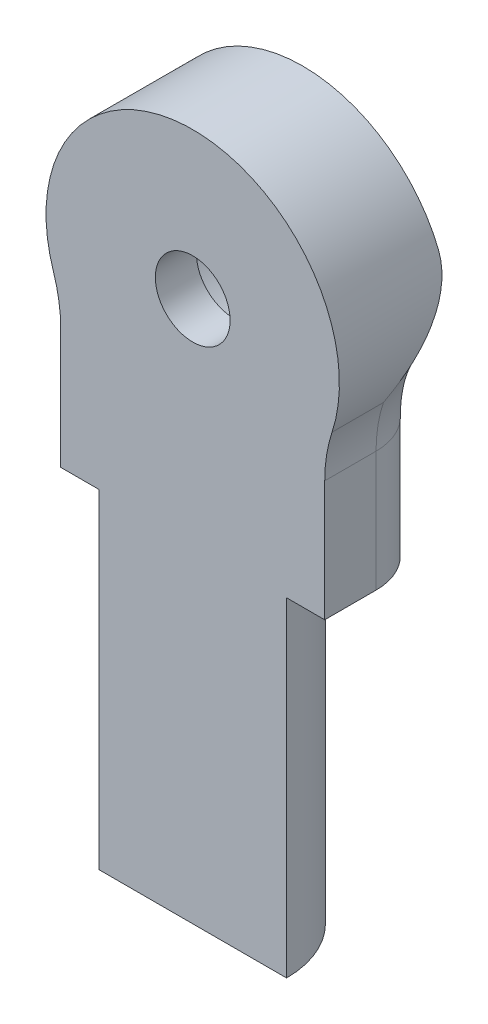
ISO-10303-21;
HEADER;
FILE_DESCRIPTION(('STEP AP214'),'2;1');
FILE_NAME('part.step','',(''),(''),'','','');
FILE_SCHEMA(('AUTOMOTIVE_DESIGN { 1 0 10303 214 1 1 1 1 }'));
ENDSEC;
DATA;
#1=APPLICATION_CONTEXT('core data for automotive mechanical design processes');
#2=APPLICATION_PROTOCOL_DEFINITION('international standard','automotive_design',2000,#1);
#3=PRODUCT_CONTEXT('',#1,'mechanical');
#4=PRODUCT('Part','Part','',(#3));
#5=PRODUCT_RELATED_PRODUCT_CATEGORY('part','',(#4));
#6=PRODUCT_DEFINITION_FORMATION('','',#4);
#7=PRODUCT_DEFINITION_CONTEXT('part definition',#1,'design');
#8=PRODUCT_DEFINITION('design','',#6,#7);
#9=PRODUCT_DEFINITION_SHAPE('','',#8);
#10=(LENGTH_UNIT() NAMED_UNIT(*) SI_UNIT(.MILLI.,.METRE.));
#11=(NAMED_UNIT(*) PLANE_ANGLE_UNIT() SI_UNIT($,.RADIAN.));
#12=(NAMED_UNIT(*) SI_UNIT($,.STERADIAN.) SOLID_ANGLE_UNIT());
#13=UNCERTAINTY_MEASURE_WITH_UNIT(LENGTH_MEASURE(1.E-05),#10,'distance_accuracy_value','');
#14=(GEOMETRIC_REPRESENTATION_CONTEXT(3) GLOBAL_UNCERTAINTY_ASSIGNED_CONTEXT((#13)) GLOBAL_UNIT_ASSIGNED_CONTEXT((#10,
#11,#12)) REPRESENTATION_CONTEXT('',''));
#15=CARTESIAN_POINT('',(0.,0.,0.));
#16=DIRECTION('',(0.,0.,1.));
#17=DIRECTION('',(1.,0.,0.));
#18=AXIS2_PLACEMENT_3D('',#15,#16,#17);
#19=CARTESIAN_POINT('',(386.036266541694,1436.9001334927,-7.54354295016557));
#20=DIRECTION('',(0.,1.,0.));
#21=DIRECTION('',(0.,0.,1.));
#22=AXIS2_PLACEMENT_3D('',#19,#20,#21);
#23=PLANE('',#22);
#24=CARTESIAN_POINT('',(386.84094038867,1436.90013349268,-5.42759696128918E-12));
#25=DIRECTION('',(0.,1.,2.55709941051272E-12));
#26=DIRECTION('',(0.,-2.55709941051272E-12,1.));
#27=AXIS2_PLACEMENT_3D('',#24,#25,#26);
#28=CIRCLE('',#27,7.49999999999444);
#29=CARTESIAN_POINT('',(386.0362665417,1436.90013349269,-7.45670838909509));
#30=VERTEX_POINT('',#29);
#31=CARTESIAN_POINT('',(387.64561423564,1436.90013349269,-7.456708389095));
#32=VERTEX_POINT('',#31);
#33=EDGE_CURVE('E20',#30,#32,#28,.F.);
#34=ORIENTED_EDGE('',*,*,#33,.F.);
#35=DIRECTION('',(0.,0.,-1.));
#36=VECTOR('',#35,1.);
#37=CARTESIAN_POINT('',(386.036266541701,1436.9001334927,-5.15000000000001));
#38=LINE('',#37,#36);
#39=CARTESIAN_POINT('',(386.036266541699,1436.9001334927,-2.8));
#40=VERTEX_POINT('',#39);
#41=EDGE_CURVE('E118',#40,#30,#38,.T.);
#42=ORIENTED_EDGE('',*,*,#41,.F.);
#43=DIRECTION('',(1.,0.,0.));
#44=VECTOR('',#43,1.);
#45=CARTESIAN_POINT('',(386.840940388668,1436.9001334927,-2.8));
#46=LINE('',#45,#44);
#47=CARTESIAN_POINT('',(387.645614235642,1436.9001334927,-2.8));
#48=VERTEX_POINT('',#47);
#49=EDGE_CURVE('E112',#40,#48,#46,.T.);
#50=ORIENTED_EDGE('',*,*,#49,.T.);
#51=DIRECTION('',(0.,0.,1.));
#52=VECTOR('',#51,1.);
#53=CARTESIAN_POINT('',(387.645614235642,1436.9001334927,-5.15000000000001));
#54=LINE('',#53,#52);
#55=EDGE_CURVE('E114',#32,#48,#54,.T.);
#56=ORIENTED_EDGE('',*,*,#55,.F.);
#57=EDGE_LOOP('',(#34,#42,#50,#56));
#58=FACE_BOUND('',#57,.T.);
#59=ADVANCED_FACE('F16',(#58),#23,.T.);
#60=CARTESIAN_POINT('',(386.84094038867,1436.85013349268,-5.55545193181572E-12));
#61=DIRECTION('',(0.,1.,2.55709941051272E-12));
#62=DIRECTION('',(0.,-2.55709941051272E-12,1.));
#63=AXIS2_PLACEMENT_3D('',#60,#61,#62);
#64=CYLINDRICAL_SURFACE('',#63,7.49999999999444);
#65=CARTESIAN_POINT('',(386.840940388673,1436.8501334927,-7.5));
#66=CARTESIAN_POINT('',(386.975954930748,1436.85016545624,-7.4999670887391));
#67=CARTESIAN_POINT('',(387.110518355698,1436.85434810467,-7.49634299886668));
#68=CARTESIAN_POINT('',(387.378742971354,1436.87101477134,-7.48191246189858));
#69=CARTESIAN_POINT('',(387.512404162059,1436.88349878957,-7.47110601480267));
#70=CARTESIAN_POINT('',(387.64561423564,1436.9001334927,-7.45670838909501));
#71=B_SPLINE_CURVE_WITH_KNOTS('',3,(#65,#66,#67,#68,#69,#70),.UNSPECIFIED.,.F.,.F.,(4,2,4),(0.,
0.404031552217608,0.808063104447917),.UNSPECIFIED.);
#72=CARTESIAN_POINT('',(386.840940388671,1436.8501334927,-7.5));
#73=VERTEX_POINT('',#72);
#74=EDGE_CURVE('E107',#73,#32,#71,.T.);
#75=ORIENTED_EDGE('',*,*,#74,.F.);
#76=CARTESIAN_POINT('',(386.0362665417,1436.9001334927,-7.45670838909508));
#77=CARTESIAN_POINT('',(386.169476615282,1436.88349878957,-7.47110601480281));
#78=CARTESIAN_POINT('',(386.303137805988,1436.87101477134,-7.48191246189875));
#79=CARTESIAN_POINT('',(386.571362421646,1436.85434810467,-7.49634299886683));
#80=CARTESIAN_POINT('',(386.705925846597,1436.85016545624,-7.4999670887392));
#81=CARTESIAN_POINT('',(386.840940388672,1436.8501334927,-7.5));
#82=B_SPLINE_CURVE_WITH_KNOTS('',3,(#76,#77,#78,#79,#80,#81),.UNSPECIFIED.,.F.,.F.,(4,2,4),(0.,
0.404031552232706,0.808063104452681),.UNSPECIFIED.);
#83=EDGE_CURVE('E110',#30,#73,#82,.T.);
#84=ORIENTED_EDGE('',*,*,#83,.F.);
#85=ORIENTED_EDGE('',*,*,#33,.T.);
#86=EDGE_LOOP('',(#75,#84,#85));
#87=FACE_BOUND('',#86,.T.);
#88=ADVANCED_FACE('F105',(#87),#64,.T.);
#89=CARTESIAN_POINT('',(386.840940388669,1443.3501334927,-2.8));
#90=DIRECTION('',(0.,0.,-1.));
#91=DIRECTION('',(-1.,0.,0.));
#92=AXIS2_PLACEMENT_3D('',#89,#90,#91);
#93=CYLINDRICAL_SURFACE('',#92,6.49999999999992);
#94=CARTESIAN_POINT('',(386.840940388669,1443.3501334927,-7.5));
#95=DIRECTION('',(0.,0.,-1.));
#96=DIRECTION('',(-1.,0.,0.));
#97=AXIS2_PLACEMENT_3D('',#94,#95,#96);
#98=CIRCLE('',#97,6.49999999999992);
#99=CARTESIAN_POINT('',(381.643795548625,1439.44632951304,-7.4999999999991));
#100=VERTEX_POINT('',#99);
#101=EDGE_CURVE('E205',#100,#73,#98,.F.);
#102=ORIENTED_EDGE('',*,*,#101,.F.);
#103=CARTESIAN_POINT('',(380.341210228718,1443.40936057959,-7.49999999999863));
#104=CARTESIAN_POINT('',(380.340428309313,1443.32355292125,-7.49999660013714));
#105=CARTESIAN_POINT('',(380.341345963116,1443.23774289222,-7.49942033392304));
#106=CARTESIAN_POINT('',(380.346576284159,1443.06623919709,-7.49747011062883));
#107=CARTESIAN_POINT('',(380.35088878153,1442.98054552538,-7.49609619346202));
#108=CARTESIAN_POINT('',(380.368910392512,1442.72383750533,-7.49130041846639));
#109=CARTESIAN_POINT('',(380.387703356597,1442.55316628389,-7.48720429433616));
#110=CARTESIAN_POINT('',(380.438086849718,1442.2181234057,-7.47958497365233));
#111=CARTESIAN_POINT('',(380.469343648116,1442.05370126578,-7.47604995926381));
#112=CARTESIAN_POINT('',(380.544450292191,1441.72773446541,-7.47084536837135));
#113=CARTESIAN_POINT('',(380.588299087525,1441.56618956616,-7.46917563633437));
#114=CARTESIAN_POINT('',(380.692710338751,1441.23297444878,-7.46827487958888));
#115=CARTESIAN_POINT('',(380.754400078274,1441.06165620964,-7.46927019357547));
#116=CARTESIAN_POINT('',(380.89194159599,1440.72477332455,-7.47378876066873));
#117=CARTESIAN_POINT('',(380.967796673923,1440.55921002985,-7.47731260332748));
#118=CARTESIAN_POINT('',(381.092918215878,1440.31385363849,-7.48332907719486));
#119=CARTESIAN_POINT('',(381.137196926199,1440.23147070031,-7.48549090728031));
#120=CARTESIAN_POINT('',(381.229270925507,1440.06868454212,-7.48971759650977));
#121=CARTESIAN_POINT('',(381.277066196328,1439.98828131189,-7.49178245615461));
#122=CARTESIAN_POINT('',(381.376079177603,1439.82961722929,-7.49544069594076));
#123=CARTESIAN_POINT('',(381.427296355337,1439.75135604611,-7.49703414926184));
#124=CARTESIAN_POINT('',(381.533067520764,1439.59710331552,-7.49931024272438));
#125=CARTESIAN_POINT('',(381.58762168092,1439.52111188572,-7.49999283574916));
#126=CARTESIAN_POINT('',(381.643795548622,1439.44632951305,-7.49999999999863));
#127=B_SPLINE_CURVE_WITH_KNOTS('',3,(#103,#104,#105,#106,#107,#108,#109,#110,#111,#112,#113,
#114,#115,#116,#117,#118,#119,#120,#121,#122,#123,#124,#125,#126),.UNSPECIFIED.,.F.,.F.,(4,2,2,
2,2,2,2,2,2,2,2,4),(0.,0.257391077907962,0.51476927744936,1.02943632632727,1.53116006417002,
2.03284196360218,2.57845187543987,3.12418904310797,3.40477721648319,3.68536394049902,
3.96590708414515,4.24646473907436),.UNSPECIFIED.);
#128=CARTESIAN_POINT('',(380.341210228718,1443.4093605796,-7.4999999999991));
#129=VERTEX_POINT('',#128);
#130=EDGE_CURVE('E151',#129,#100,#127,.T.);
#131=ORIENTED_EDGE('',*,*,#130,.F.);
#132=CARTESIAN_POINT('',(386.840940388669,1443.3501334927,-7.5));
#133=DIRECTION('',(0.,0.,-1.));
#134=DIRECTION('',(-1.,0.,0.));
#135=AXIS2_PLACEMENT_3D('',#132,#133,#134);
#136=CIRCLE('',#135,6.49999999999992);
#137=CARTESIAN_POINT('',(393.34067054862,1443.40936057959,-7.50000000000003));
#138=VERTEX_POINT('',#137);
#139=EDGE_CURVE('E159',#138,#129,#136,.F.);
#140=ORIENTED_EDGE('',*,*,#139,.F.);
#141=CARTESIAN_POINT('',(392.038085228719,1439.44632951305,-7.50000000000005));
#142=CARTESIAN_POINT('',(392.089622196025,1439.51494078493,-7.49999660013862));
#143=CARTESIAN_POINT('',(392.139792413368,1439.58456227918,-7.49942033392457));
#144=CARTESIAN_POINT('',(392.237330827045,1439.72572577148,-7.49747011063048));
#145=CARTESIAN_POINT('',(392.28469916345,1439.79726767327,-7.49609619346373));
#146=CARTESIAN_POINT('',(392.422490168395,1440.01460939724,-7.49130041846828));
#147=CARTESIAN_POINT('',(392.508616768749,1440.16314912269,-7.48720429433816));
#148=CARTESIAN_POINT('',(392.666830556635,1440.46274989693,-7.47958497365453));
#149=CARTESIAN_POINT('',(392.739216347724,1440.6136535907,-7.4760499592661));
#150=CARTESIAN_POINT('',(392.872143390748,1440.92061574497,-7.47084536837379));
#151=CARTESIAN_POINT('',(392.932685629888,1441.07667377458,-7.46917563633686));
#152=CARTESIAN_POINT('',(393.046322708055,1441.40685650929,-7.46827487959143));
#153=CARTESIAN_POINT('',(393.098301263484,1441.58136666028,-7.46927019357803));
#154=CARTESIAN_POINT('',(393.187444471318,1441.93415730055,-7.47378876067124));
#155=CARTESIAN_POINT('',(393.22460566576,1442.11243865972,-7.47731260332992));
#156=CARTESIAN_POINT('',(393.269446590916,1442.38418201377,-7.48332907719717));
#157=CARTESIAN_POINT('',(393.282677951092,1442.47676972246,-7.48549090728258));
#158=CARTESIAN_POINT('',(393.305135308694,1442.66243776423,-7.48971759651191));
#159=CARTESIAN_POINT('',(393.314361326809,1442.75551809477,-7.49178245615668));
#160=CARTESIAN_POINT('',(393.328787280317,1442.9419845889,-7.49544069594266));
#161=CARTESIAN_POINT('',(393.333987840813,1443.03537070275,-7.49703414926365));
#162=CARTESIAN_POINT('',(393.340356312052,1443.22229551893,-7.49931024272601));
#163=CARTESIAN_POINT('',(393.34152401419,1443.31583422891,-7.49999283575068));
#164=CARTESIAN_POINT('',(393.34067054862,1443.40936057959,-7.50000000000005));
#165=B_SPLINE_CURVE_WITH_KNOTS('',3,(#141,#142,#143,#144,#145,#146,#147,#148,#149,#150,#151,
#152,#153,#154,#155,#156,#157,#158,#159,#160,#161,#162,#163,#164),.UNSPECIFIED.,.F.,.F.,(4,2,2,
2,2,2,2,2,2,2,2,4),(0.,0.257391077907742,0.514769277449198,1.02943632632671,1.53116006416917,
2.0328419636007,2.57845187543807,3.12418904310537,3.40477721648091,3.68536394049646,
3.96590708414197,4.24646473907042),.UNSPECIFIED.);
#166=CARTESIAN_POINT('',(392.038085228718,1439.44632951305,-7.50000000000003));
#167=VERTEX_POINT('',#166);
#168=EDGE_CURVE('E144',#167,#138,#165,.T.);
#169=ORIENTED_EDGE('',*,*,#168,.F.);
#170=CARTESIAN_POINT('',(386.840940388669,1443.3501334927,-7.5));
#171=DIRECTION('',(0.,0.,-1.));
#172=DIRECTION('',(-1.,0.,0.));
#173=AXIS2_PLACEMENT_3D('',#170,#171,#172);
#174=CIRCLE('',#173,6.49999999999992);
#175=EDGE_CURVE('E123',#73,#167,#174,.F.);
#176=ORIENTED_EDGE('',*,*,#175,.F.);
#177=ORIENTED_EDGE('',*,*,#74,.T.);
#178=ORIENTED_EDGE('',*,*,#55,.T.);
#179=CARTESIAN_POINT('',(386.840940388669,1443.3501334927,-2.8));
#180=DIRECTION('',(0.,0.,-1.));
#181=DIRECTION('',(-1.,0.,0.));
#182=AXIS2_PLACEMENT_3D('',#179,#180,#181);
#183=CIRCLE('',#182,6.49999999999992);
#184=EDGE_CURVE('E201',#40,#48,#183,.T.);
#185=ORIENTED_EDGE('',*,*,#184,.F.);
#186=ORIENTED_EDGE('',*,*,#41,.T.);
#187=ORIENTED_EDGE('',*,*,#83,.T.);
#188=EDGE_LOOP('',(#102,#131,#140,#169,#176,#177,#178,#185,#186,#187));
#189=FACE_BOUND('',#188,.T.);
#190=ADVANCED_FACE('F121',(#189),#93,.F.);
#191=CARTESIAN_POINT('',(405.840940388658,1437.1051354943,-3.50000000000484));
#192=DIRECTION('',(0.,0.,1.));
#193=DIRECTION('',(1.,0.,0.));
#194=AXIS2_PLACEMENT_3D('',#191,#192,#193);
#195=TOROIDAL_SURFACE('',#194,13.9999999999879,3.9999999999952);
#196=CARTESIAN_POINT('',(391.840940388671,1437.1051354943,-3.50000000000166));
#197=DIRECTION('',(0.,-1.,0.));
#198=DIRECTION('',(0.,0.,-1.));
#199=AXIS2_PLACEMENT_3D('',#196,#197,#198);
#200=CIRCLE('',#199,3.99999999999927);
#201=CARTESIAN_POINT('',(391.840940388671,1437.1051354943,-7.50000000000027));
#202=VERTEX_POINT('',#201);
#203=CARTESIAN_POINT('',(395.840940388669,1437.1051354943,-3.49999999999991));
#204=VERTEX_POINT('',#203);
#205=EDGE_CURVE('E204',#202,#204,#200,.T.);
#206=ORIENTED_EDGE('',*,*,#205,.F.);
#207=CARTESIAN_POINT('',(405.840940388658,1437.1051354943,-7.50000000000004));
#208=DIRECTION('',(0.,0.,1.));
#209=DIRECTION('',(1.,0.,0.));
#210=AXIS2_PLACEMENT_3D('',#207,#208,#209);
#211=CIRCLE('',#210,13.9999999999888);
#212=EDGE_CURVE('E213',#167,#202,#211,.T.);
#213=ORIENTED_EDGE('',*,*,#212,.F.);
#214=ORIENTED_EDGE('',*,*,#168,.T.);
#215=CARTESIAN_POINT('',(405.840940388658,1437.1051354943,-7.50000000000004));
#216=DIRECTION('',(0.,0.,1.));
#217=DIRECTION('',(1.,0.,0.));
#218=AXIS2_PLACEMENT_3D('',#215,#216,#217);
#219=CIRCLE('',#218,13.9999999999893);
#220=CARTESIAN_POINT('',(396.090324531704,1447.15130344083,-7.50000000000003));
#221=VERTEX_POINT('',#220);
#222=EDGE_CURVE('E394',#221,#138,#219,.T.);
#223=ORIENTED_EDGE('',*,*,#222,.F.);
#224=CARTESIAN_POINT('',(396.090324531705,1447.15130344083,-7.50000000000005));
#225=CARTESIAN_POINT('',(396.143817208727,1447.02121284627,-7.50002436433455));
#226=CARTESIAN_POINT('',(396.194478665828,1446.89006101888,-7.49360658438374));
#227=CARTESIAN_POINT('',(396.289844528939,1446.62696177442,-7.46893774290404));
#228=CARTESIAN_POINT('',(396.334559457219,1446.49501620639,-7.45070792759163));
#229=CARTESIAN_POINT('',(396.417380936123,1446.23292265691,-7.40377045561446));
#230=CARTESIAN_POINT('',(396.455566905777,1446.10277393117,-7.37520424157904));
#231=CARTESIAN_POINT('',(396.526103233392,1445.84326569439,-7.30861956254425));
#232=CARTESIAN_POINT('',(396.558450343193,1445.71390666107,-7.27059586413978));
#233=CARTESIAN_POINT('',(396.627826691224,1445.41136647308,-7.17128362185222));
#234=CARTESIAN_POINT('',(396.662498563672,1445.23878160593,-7.1065166645541));
#235=CARTESIAN_POINT('',(396.722043218678,1444.89734762035,-6.96409723549154));
#236=CARTESIAN_POINT('',(396.746913342502,1444.72849952722,-6.88644127567715));
#237=CARTESIAN_POINT('',(396.808227472831,1444.22620854852,-6.63636526971032));
#238=CARTESIAN_POINT('',(396.830914977617,1443.89911447523,-6.44757273291196));
#239=CARTESIAN_POINT('',(396.841812100923,1443.42812447654,-6.14657395441475));
#240=CARTESIAN_POINT('',(396.841787100105,1443.27700623849,-6.0452825702599));
#241=CARTESIAN_POINT('',(396.835153529833,1442.97875934002,-5.83717643045856));
#242=CARTESIAN_POINT('',(396.828545911396,1442.83163010644,-5.73036247479486));
#243=CARTESIAN_POINT('',(396.799549162859,1442.39555000864,-5.40306673331781));
#244=CARTESIAN_POINT('',(396.767981252346,1442.11219902307,-5.17592276995079));
#245=CARTESIAN_POINT('',(396.683069809682,1441.55823193143,-4.71131041384988));
#246=CARTESIAN_POINT('',(396.629747243396,1441.28760384306,-4.47385215775895));
#247=CARTESIAN_POINT('',(396.50247590521,1440.75603542316,-3.99405616431096));
#248=CARTESIAN_POINT('',(396.428542390699,1440.49508808668,-3.75172215890891));
#249=CARTESIAN_POINT('',(396.343132886603,1440.23431098328,-3.50628538114124));
#250=CARTESIAN_POINT('',(396.34203751105,1440.23097244453,-3.50314268441602));
#251=CARTESIAN_POINT('',(396.340940388669,1440.2276344935,-3.50000000000485));
#252=B_SPLINE_CURVE_WITH_KNOTS('',3,(#224,#225,#226,#227,#228,#229,#230,#231,#232,#233,#234,
#235,#236,#237,#238,#239,#240,#241,#242,#243,#244,#245,#246,#247,#248,#249,#250,#251),
.UNSPECIFIED.,.F.,.F.,(4,2,2,2,2,2,2,2,2,2,2,2,2,4),(0.,0.42165983060148,0.84256332246063,
1.25791247211263,1.67349197321856,2.23529890243517,2.79725811770752,3.92790096414332,
4.47354612279656,5.01911246121202,6.11128925436452,7.20241594860105,8.29273706428958,
8.30687920100464),.UNSPECIFIED.);
#253=CARTESIAN_POINT('',(396.340940388666,1440.2276344935,-3.50000000000146));
#254=VERTEX_POINT('',#253);
#255=EDGE_CURVE('E194',#254,#221,#252,.F.);
#256=ORIENTED_EDGE('',*,*,#255,.F.);
#257=CARTESIAN_POINT('',(405.840940388683,1437.1051354943,-3.5));
#258=DIRECTION('',(0.,0.,-1.));
#259=DIRECTION('',(-1.,0.,0.));
#260=AXIS2_PLACEMENT_3D('',#257,#258,#259);
#261=CIRCLE('',#260,10.000000000014);
#262=EDGE_CURVE('E234',#204,#254,#261,.T.);
#263=ORIENTED_EDGE('',*,*,#262,.F.);
#264=EDGE_LOOP('',(#206,#213,#214,#223,#256,#263));
#265=FACE_BOUND('',#264,.T.);
#266=ADVANCED_FACE('F139',(#265),#195,.T.);
#267=CARTESIAN_POINT('',(396.090324531704,1443.40936057959,-7.5));
#268=DIRECTION('',(0.,0.,-1.));
#269=DIRECTION('',(-1.,0.,0.));
#270=AXIS2_PLACEMENT_3D('',#267,#268,#269);
#271=PLANE('',#270);
#272=ORIENTED_EDGE('',*,*,#139,.T.);
#273=CARTESIAN_POINT('',(367.840940388694,1437.1051354943,-7.49999999999863));
#274=DIRECTION('',(0.,0.,-1.));
#275=DIRECTION('',(-1.,0.,0.));
#276=AXIS2_PLACEMENT_3D('',#273,#274,#275);
#277=CIRCLE('',#276,13.9999999999868);
#278=CARTESIAN_POINT('',(377.591556245637,1447.15130344083,-7.49999999999905));
#279=VERTEX_POINT('',#278);
#280=EDGE_CURVE('E158',#279,#129,#277,.T.);
#281=ORIENTED_EDGE('',*,*,#280,.F.);
#282=CARTESIAN_POINT('',(386.840940388667,1443.3501334927,-7.5));
#283=DIRECTION('',(0.,0.,-1.));
#284=DIRECTION('',(-1.,0.,0.));
#285=AXIS2_PLACEMENT_3D('',#282,#283,#284);
#286=CIRCLE('',#285,10.0000000000033);
#287=EDGE_CURVE('E179',#221,#279,#286,.F.);
#288=ORIENTED_EDGE('',*,*,#287,.F.);
#289=ORIENTED_EDGE('',*,*,#222,.T.);
#290=EDGE_LOOP('',(#272,#281,#288,#289));
#291=FACE_BOUND('',#290,.T.);
#292=ADVANCED_FACE('F166',(#291),#271,.T.);
#293=CARTESIAN_POINT('',(367.840940388694,1437.1051354943,-3.50000000000036));
#294=DIRECTION('',(0.,0.,-1.));
#295=DIRECTION('',(-1.,0.,0.));
#296=AXIS2_PLACEMENT_3D('',#293,#294,#295);
#297=TOROIDAL_SURFACE('',#296,13.9999999999854,3.99999999999827);
#298=CARTESIAN_POINT('',(377.59155624563,1447.15130344083,-7.49999999999863));
#299=CARTESIAN_POINT('',(377.538063568879,1447.02121284693,-7.50002436433246));
#300=CARTESIAN_POINT('',(377.487402112019,1446.89006102021,-7.49360658444661));
#301=CARTESIAN_POINT('',(377.392036249341,1446.62696177712,-7.46893774321404));
#302=CARTESIAN_POINT('',(377.347321321251,1446.49501620979,-7.45070792808623));
#303=CARTESIAN_POINT('',(377.264499842232,1446.23292266033,-7.40377045633502));
#304=CARTESIAN_POINT('',(377.226313872335,1446.10277393392,-7.37520424223031));
#305=CARTESIAN_POINT('',(377.155777544288,1445.84326569577,-7.30861956294724));
#306=CARTESIAN_POINT('',(377.123430434299,1445.71390666176,-7.27059586436182));
#307=CARTESIAN_POINT('',(377.054054085971,1445.41136647247,-7.17128362164786));
#308=CARTESIAN_POINT('',(377.019382213419,1445.23878160472,-7.10651666409546));
#309=CARTESIAN_POINT('',(376.959837558285,1444.89734761804,-6.96409723446905));
#310=CARTESIAN_POINT('',(376.934967434432,1444.72849952442,-6.88644127435115));
#311=CARTESIAN_POINT('',(376.87365330436,1444.22620854637,-6.63636526848417));
#312=CARTESIAN_POINT('',(376.850965799715,1443.89911447414,-6.44757273232198));
#313=CARTESIAN_POINT('',(376.840068676404,1443.4281244767,-6.14657395444615));
#314=CARTESIAN_POINT('',(376.840093677199,1443.27700623882,-6.04528257029827));
#315=CARTESIAN_POINT('',(376.846727247516,1442.97875934041,-5.83717643090037));
#316=CARTESIAN_POINT('',(376.853334866018,1442.83163010674,-5.73036247563454));
#317=CARTESIAN_POINT('',(376.882331614117,1442.39555001102,-5.40306673382775));
#318=CARTESIAN_POINT('',(376.913899523482,1442.11219902932,-5.17592276774767));
#319=CARTESIAN_POINT('',(376.998810968299,1441.55823193079,-4.71131042069736));
#320=CARTESIAN_POINT('',(377.052133537991,1441.28760383174,-4.47385217630413));
#321=CARTESIAN_POINT('',(377.179404867134,1440.7560354384,-3.99405614922216));
#322=CARTESIAN_POINT('',(377.253338369232,1440.49508813914,-3.75172209852503));
#323=CARTESIAN_POINT('',(377.338747890298,1440.23431098462,-3.50628537956205));
#324=CARTESIAN_POINT('',(377.339843266069,1440.2309724452,-3.50314268361535));
#325=CARTESIAN_POINT('',(377.340940388675,1440.2276344935,-3.50000000000036));
#326=B_SPLINE_CURVE_WITH_KNOTS('',3,(#298,#299,#300,#301,#302,#303,#304,#305,#306,#307,#308,
#309,#310,#311,#312,#313,#314,#315,#316,#317,#318,#319,#320,#321,#322,#323,#324,#325),
.UNSPECIFIED.,.F.,.F.,(4,2,2,2,2,2,2,2,2,2,2,2,2,4),(0.,0.421659828472291,0.842563318112273,
1.2579124698956,1.67349197321877,2.23529890441547,2.79725812140247,3.92790096414447,
4.47354612239288,5.01911246026122,6.11128924982657,7.20241594576188,8.29273706429318,
8.30687920100791),.UNSPECIFIED.);
#327=CARTESIAN_POINT('',(377.340940388671,1440.2276344935,-3.50000000000079));
#328=VERTEX_POINT('',#327);
#329=EDGE_CURVE('E171',#279,#328,#326,.T.);
#330=ORIENTED_EDGE('',*,*,#329,.F.);
#331=ORIENTED_EDGE('',*,*,#280,.T.);
#332=ORIENTED_EDGE('',*,*,#130,.T.);
#333=CARTESIAN_POINT('',(367.840940388694,1437.1051354943,-7.49999999999863));
#334=DIRECTION('',(0.,0.,-1.));
#335=DIRECTION('',(-1.,0.,0.));
#336=AXIS2_PLACEMENT_3D('',#333,#334,#335);
#337=CIRCLE('',#336,13.9999999999823);
#338=CARTESIAN_POINT('',(381.840940388676,1437.1051354943,-7.49999999999932));
#339=VERTEX_POINT('',#338);
#340=EDGE_CURVE('E209',#339,#100,#337,.F.);
#341=ORIENTED_EDGE('',*,*,#340,.F.);
#342=CARTESIAN_POINT('',(381.840940388676,1437.1051354943,-3.49999999999972));
#343=DIRECTION('',(0.,-1.,0.));
#344=DIRECTION('',(0.,0.,-1.));
#345=AXIS2_PLACEMENT_3D('',#342,#343,#344);
#346=CIRCLE('',#345,4.00000000000044);
#347=CARTESIAN_POINT('',(377.840940388676,1437.1051354943,-3.5));
#348=VERTEX_POINT('',#347);
#349=EDGE_CURVE('E214',#348,#339,#346,.T.);
#350=ORIENTED_EDGE('',*,*,#349,.F.);
#351=CARTESIAN_POINT('',(367.840940388663,1437.1051354943,-3.5));
#352=DIRECTION('',(0.,0.,-1.));
#353=DIRECTION('',(-1.,0.,0.));
#354=AXIS2_PLACEMENT_3D('',#351,#352,#353);
#355=CIRCLE('',#354,10.0000000000126);
#356=EDGE_CURVE('E228',#328,#348,#355,.T.);
#357=ORIENTED_EDGE('',*,*,#356,.F.);
#358=EDGE_LOOP('',(#330,#331,#332,#341,#350,#357));
#359=FACE_BOUND('',#358,.T.);
#360=ADVANCED_FACE('F161',(#359),#297,.T.);
#361=CARTESIAN_POINT('',(381.840940388676,1437.1051354943,-3.49999999999972));
#362=DIRECTION('',(0.,-1.,0.));
#363=DIRECTION('',(0.,0.,-1.));
#364=AXIS2_PLACEMENT_3D('',#361,#362,#363);
#365=CYLINDRICAL_SURFACE('',#364,4.00000000000044);
#366=ORIENTED_EDGE('',*,*,#349,.T.);
#367=DIRECTION('',(0.,1.,0.));
#368=VECTOR('',#367,1.);
#369=CARTESIAN_POINT('',(381.840940388676,1434.17323150288,-7.5));
#370=LINE('',#369,#368);
#371=CARTESIAN_POINT('',(381.840940388676,1428.9001334927,-7.5));
#372=VERTEX_POINT('',#371);
#373=EDGE_CURVE('E212',#372,#339,#370,.T.);
#374=ORIENTED_EDGE('',*,*,#373,.F.);
#375=CARTESIAN_POINT('',(381.840940388676,1428.9001334927,-3.49999999999972));
#376=DIRECTION('',(0.,-1.,0.));
#377=DIRECTION('',(0.,0.,-1.));
#378=AXIS2_PLACEMENT_3D('',#375,#376,#377);
#379=CIRCLE('',#378,4.00000000000044);
#380=CARTESIAN_POINT('',(377.840940388676,1428.9001334927,-3.49999999999986));
#381=VERTEX_POINT('',#380);
#382=EDGE_CURVE('E180',#381,#372,#379,.T.);
#383=ORIENTED_EDGE('',*,*,#382,.F.);
#384=DIRECTION('',(0.,-1.,0.));
#385=VECTOR('',#384,1.);
#386=CARTESIAN_POINT('',(377.840940388676,1433.0026344935,-3.5));
#387=LINE('',#386,#385);
#388=EDGE_CURVE('E280',#348,#381,#387,.T.);
#389=ORIENTED_EDGE('',*,*,#388,.F.);
#390=EDGE_LOOP('',(#366,#374,#383,#389));
#391=FACE_BOUND('',#390,.T.);
#392=ADVANCED_FACE('F165',(#391),#365,.T.);
#393=CARTESIAN_POINT('',(392.038085228718,1428.9001334927,-7.5));
#394=DIRECTION('',(0.,0.,-1.));
#395=DIRECTION('',(-1.,0.,0.));
#396=AXIS2_PLACEMENT_3D('',#393,#394,#395);
#397=PLANE('',#396);
#398=ORIENTED_EDGE('',*,*,#340,.T.);
#399=ORIENTED_EDGE('',*,*,#101,.T.);
#400=ORIENTED_EDGE('',*,*,#175,.T.);
#401=ORIENTED_EDGE('',*,*,#212,.T.);
#402=DIRECTION('',(0.,1.,0.));
#403=VECTOR('',#402,1.);
#404=CARTESIAN_POINT('',(391.840940388671,1433.0026344935,-7.50000000000034));
#405=LINE('',#404,#403);
#406=CARTESIAN_POINT('',(391.840940388671,1428.9001334927,-7.50000000000017));
#407=VERTEX_POINT('',#406);
#408=EDGE_CURVE('E208',#407,#202,#405,.T.);
#409=ORIENTED_EDGE('',*,*,#408,.F.);
#410=DIRECTION('',(1.,0.,0.));
#411=VECTOR('',#410,1.);
#412=CARTESIAN_POINT('',(386.840940388673,1428.9001334927,-7.5));
#413=LINE('',#412,#411);
#414=EDGE_CURVE('E266',#372,#407,#413,.T.);
#415=ORIENTED_EDGE('',*,*,#414,.F.);
#416=ORIENTED_EDGE('',*,*,#373,.T.);
#417=EDGE_LOOP('',(#398,#399,#400,#401,#409,#415,#416));
#418=FACE_BOUND('',#417,.T.);
#419=ADVANCED_FACE('F386',(#418),#397,.T.);
#420=CARTESIAN_POINT('',(391.840940388671,1428.9001334927,-3.50000000000166));
#421=DIRECTION('',(0.,1.,0.));
#422=DIRECTION('',(0.,0.,1.));
#423=AXIS2_PLACEMENT_3D('',#420,#421,#422);
#424=CYLINDRICAL_SURFACE('',#423,3.99999999999927);
#425=ORIENTED_EDGE('',*,*,#205,.T.);
#426=DIRECTION('',(-4.8711784444067E-13,1.,0.));
#427=VECTOR('',#426,1.);
#428=CARTESIAN_POINT('',(395.840940388669,1433.0026344935,-3.5));
#429=LINE('',#428,#427);
#430=CARTESIAN_POINT('',(395.840940388671,1428.9001334927,-3.50000000000136));
#431=VERTEX_POINT('',#430);
#432=EDGE_CURVE('E203',#431,#204,#429,.T.);
#433=ORIENTED_EDGE('',*,*,#432,.F.);
#434=CARTESIAN_POINT('',(391.840940388671,1428.9001334927,-3.50000000000166));
#435=DIRECTION('',(0.,1.,0.));
#436=DIRECTION('',(0.,0.,1.));
#437=AXIS2_PLACEMENT_3D('',#434,#435,#436);
#438=CIRCLE('',#437,3.99999999999927);
#439=EDGE_CURVE('E264',#407,#431,#438,.F.);
#440=ORIENTED_EDGE('',*,*,#439,.F.);
#441=ORIENTED_EDGE('',*,*,#408,.T.);
#442=EDGE_LOOP('',(#425,#433,#440,#441));
#443=FACE_BOUND('',#442,.T.);
#444=ADVANCED_FACE('F384',(#443),#424,.T.);
#445=CARTESIAN_POINT('',(393.707270478124,1436.9001334927,-2.8));
#446=DIRECTION('',(0.,0.,-1.));
#447=DIRECTION('',(-1.,0.,0.));
#448=AXIS2_PLACEMENT_3D('',#445,#446,#447);
#449=PLANE('',#448);
#450=CARTESIAN_POINT('',(386.840940388669,1443.3501334927,-2.8));
#451=DIRECTION('',(0.,0.,1.));
#452=DIRECTION('',(1.,0.,0.));
#453=AXIS2_PLACEMENT_3D('',#450,#451,#452);
#454=CIRCLE('',#453,2.54999999999939);
#455=CARTESIAN_POINT('',(389.390940388668,1443.3501334927,-2.8));
#456=VERTEX_POINT('',#455);
#457=EDGE_CURVE('E256',#456,#456,#454,.F.);
#458=ORIENTED_EDGE('',*,*,#457,.F.);
#459=EDGE_LOOP('',(#458));
#460=FACE_BOUND('',#459,.T.);
#461=ORIENTED_EDGE('',*,*,#184,.T.);
#462=ORIENTED_EDGE('',*,*,#49,.F.);
#463=EDGE_LOOP('',(#461,#462));
#464=FACE_BOUND('',#463,.T.);
#465=ADVANCED_FACE('F381',(#460,#464),#449,.T.);
#466=CARTESIAN_POINT('',(380.440940388677,1406.4501334927,0.));
#467=DIRECTION('',(0.,-1.,0.));
#468=DIRECTION('',(0.,0.,-1.));
#469=AXIS2_PLACEMENT_3D('',#466,#467,#468);
#470=PLANE('',#469);
#471=CARTESIAN_POINT('',(386.840940388673,1406.4501334927,0.));
#472=DIRECTION('',(0.,1.,0.));
#473=DIRECTION('',(0.,0.,1.));
#474=AXIS2_PLACEMENT_3D('',#471,#472,#473);
#475=CIRCLE('',#474,6.39999999999996);
#476=CARTESIAN_POINT('',(393.240940388672,1406.4501334927,0.));
#477=VERTEX_POINT('',#476);
#478=CARTESIAN_POINT('',(380.440940388672,1406.4501334927,0.));
#479=VERTEX_POINT('',#478);
#480=EDGE_CURVE('E260',#477,#479,#475,.T.);
#481=ORIENTED_EDGE('',*,*,#480,.F.);
#482=DIRECTION('',(1.,0.,0.));
#483=VECTOR('',#482,1.);
#484=CARTESIAN_POINT('',(386.840940388668,1406.4501334927,0.));
#485=LINE('',#484,#483);
#486=EDGE_CURVE('E259',#479,#477,#485,.T.);
#487=ORIENTED_EDGE('',*,*,#486,.F.);
#488=EDGE_LOOP('',(#481,#487));
#489=FACE_BOUND('',#488,.T.);
#490=ADVANCED_FACE('F360',(#489),#470,.T.);
#491=CARTESIAN_POINT('',(395.840940388669,1437.1051354943,0.));
#492=DIRECTION('',(1.,2.43558922220335E-13,-5.70971841235795E-13));
#493=DIRECTION('',(2.43558922220335E-13,-1.,0.));
#494=AXIS2_PLACEMENT_3D('',#491,#492,#493);
#495=PLANE('',#494);
#496=ORIENTED_EDGE('',*,*,#432,.T.);
#497=DIRECTION('',(0.,0.,-1.));
#498=VECTOR('',#497,1.);
#499=CARTESIAN_POINT('',(395.840940388669,1437.1051354943,-1.75));
#500=LINE('',#499,#498);
#501=CARTESIAN_POINT('',(395.84094038867,1437.1051354943,0.));
#502=VERTEX_POINT('',#501);
#503=EDGE_CURVE('E236',#502,#204,#500,.T.);
#504=ORIENTED_EDGE('',*,*,#503,.F.);
#505=DIRECTION('',(0.,1.,0.));
#506=VECTOR('',#505,1.);
#507=CARTESIAN_POINT('',(395.840940388671,1431.08557228006,0.));
#508=LINE('',#507,#506);
#509=CARTESIAN_POINT('',(395.840940388671,1428.9001334927,0.));
#510=VERTEX_POINT('',#509);
#511=EDGE_CURVE('E255',#510,#502,#508,.T.);
#512=ORIENTED_EDGE('',*,*,#511,.F.);
#513=DIRECTION('',(2.66453525910038E-13,0.,1.));
#514=VECTOR('',#513,1.);
#515=CARTESIAN_POINT('',(395.84094038867,1428.9001334927,-3.75));
#516=LINE('',#515,#514);
#517=EDGE_CURVE('E263',#431,#510,#516,.T.);
#518=ORIENTED_EDGE('',*,*,#517,.F.);
#519=EDGE_LOOP('',(#496,#504,#512,#518));
#520=FACE_BOUND('',#519,.T.);
#521=ADVANCED_FACE('F344',(#520),#495,.T.);
#522=CARTESIAN_POINT('',(405.840940388683,1437.1051354943,-3.5));
#523=DIRECTION('',(0.,0.,1.));
#524=DIRECTION('',(1.,0.,0.));
#525=AXIS2_PLACEMENT_3D('',#522,#523,#524);
#526=CYLINDRICAL_SURFACE('',#525,10.000000000014);
#527=ORIENTED_EDGE('',*,*,#262,.T.);
#528=DIRECTION('',(0.,0.,-1.));
#529=VECTOR('',#528,1.);
#530=CARTESIAN_POINT('',(396.340940388669,1440.2276344935,-3.75000000000001));
#531=LINE('',#530,#529);
#532=CARTESIAN_POINT('',(396.34094038867,1440.2276344935,0.));
#533=VERTEX_POINT('',#532);
#534=EDGE_CURVE('E200',#533,#254,#531,.T.);
#535=ORIENTED_EDGE('',*,*,#534,.F.);
#536=CARTESIAN_POINT('',(405.840940388683,1437.1051354943,0.));
#537=DIRECTION('',(0.,0.,1.));
#538=DIRECTION('',(1.,0.,0.));
#539=AXIS2_PLACEMENT_3D('',#536,#537,#538);
#540=CIRCLE('',#539,10.000000000014);
#541=EDGE_CURVE('E252',#502,#533,#540,.F.);
#542=ORIENTED_EDGE('',*,*,#541,.F.);
#543=ORIENTED_EDGE('',*,*,#503,.T.);
#544=EDGE_LOOP('',(#527,#535,#542,#543));
#545=FACE_BOUND('',#544,.T.);
#546=ADVANCED_FACE('F189',(#545),#526,.F.);
#547=CARTESIAN_POINT('',(386.840940388667,1443.3501334927,0.));
#548=DIRECTION('',(0.,0.,-1.));
#549=DIRECTION('',(-1.,0.,0.));
#550=AXIS2_PLACEMENT_3D('',#547,#548,#549);
#551=CYLINDRICAL_SURFACE('',#550,10.0000000000033);
#552=ORIENTED_EDGE('',*,*,#329,.T.);
#553=DIRECTION('',(0.,0.,-1.));
#554=VECTOR('',#553,1.);
#555=CARTESIAN_POINT('',(377.340940388676,1440.2276344935,-1.75));
#556=LINE('',#555,#554);
#557=CARTESIAN_POINT('',(377.340940388676,1440.2276344935,0.));
#558=VERTEX_POINT('',#557);
#559=EDGE_CURVE('E178',#558,#328,#556,.T.);
#560=ORIENTED_EDGE('',*,*,#559,.F.);
#561=CARTESIAN_POINT('',(386.840940388667,1443.3501334927,0.));
#562=DIRECTION('',(0.,0.,-1.));
#563=DIRECTION('',(-1.,0.,0.));
#564=AXIS2_PLACEMENT_3D('',#561,#562,#563);
#565=CIRCLE('',#564,10.0000000000033);
#566=EDGE_CURVE('E249',#533,#558,#565,.F.);
#567=ORIENTED_EDGE('',*,*,#566,.F.);
#568=ORIENTED_EDGE('',*,*,#534,.T.);
#569=ORIENTED_EDGE('',*,*,#255,.T.);
#570=ORIENTED_EDGE('',*,*,#287,.T.);
#571=EDGE_LOOP('',(#552,#560,#567,#568,#569,#570));
#572=FACE_BOUND('',#571,.T.);
#573=ADVANCED_FACE('F183',(#572),#551,.T.);
#574=CARTESIAN_POINT('',(367.840940388663,1437.1051354943,0.));
#575=DIRECTION('',(0.,0.,-1.));
#576=DIRECTION('',(-1.,0.,0.));
#577=AXIS2_PLACEMENT_3D('',#574,#575,#576);
#578=CYLINDRICAL_SURFACE('',#577,10.0000000000126);
#579=ORIENTED_EDGE('',*,*,#356,.T.);
#580=DIRECTION('',(0.,0.,-1.));
#581=VECTOR('',#580,1.);
#582=CARTESIAN_POINT('',(377.840940388676,1437.1051354943,-1.75));
#583=LINE('',#582,#581);
#584=CARTESIAN_POINT('',(377.840940388676,1437.1051354943,0.));
#585=VERTEX_POINT('',#584);
#586=EDGE_CURVE('E231',#585,#348,#583,.T.);
#587=ORIENTED_EDGE('',*,*,#586,.F.);
#588=CARTESIAN_POINT('',(367.840940388663,1437.1051354943,0.));
#589=DIRECTION('',(0.,0.,-1.));
#590=DIRECTION('',(-1.,0.,0.));
#591=AXIS2_PLACEMENT_3D('',#588,#589,#590);
#592=CIRCLE('',#591,10.0000000000126);
#593=EDGE_CURVE('E245',#558,#585,#592,.T.);
#594=ORIENTED_EDGE('',*,*,#593,.F.);
#595=ORIENTED_EDGE('',*,*,#559,.T.);
#596=EDGE_LOOP('',(#579,#587,#594,#595));
#597=FACE_BOUND('',#596,.T.);
#598=ADVANCED_FACE('F188',(#597),#578,.F.);
#599=CARTESIAN_POINT('',(377.840940388676,1428.9001334927,0.));
#600=DIRECTION('',(-1.,0.,0.));
#601=DIRECTION('',(0.,1.,0.));
#602=AXIS2_PLACEMENT_3D('',#599,#600,#601);
#603=PLANE('',#602);
#604=ORIENTED_EDGE('',*,*,#388,.T.);
#605=DIRECTION('',(0.,0.,-1.));
#606=VECTOR('',#605,1.);
#607=CARTESIAN_POINT('',(377.840940388676,1428.9001334927,-3.75));
#608=LINE('',#607,#606);
#609=CARTESIAN_POINT('',(377.840940388676,1428.9001334927,0.));
#610=VERTEX_POINT('',#609);
#611=EDGE_CURVE('E274',#610,#381,#608,.T.);
#612=ORIENTED_EDGE('',*,*,#611,.F.);
#613=DIRECTION('',(0.,-1.,0.));
#614=VECTOR('',#613,1.);
#615=CARTESIAN_POINT('',(377.840940388676,1431.08557228006,0.));
#616=LINE('',#615,#614);
#617=EDGE_CURVE('E248',#585,#610,#616,.T.);
#618=ORIENTED_EDGE('',*,*,#617,.F.);
#619=ORIENTED_EDGE('',*,*,#586,.T.);
#620=EDGE_LOOP('',(#604,#612,#618,#619));
#621=FACE_BOUND('',#620,.T.);
#622=ADVANCED_FACE('F321',(#621),#603,.T.);
#623=CARTESIAN_POINT('',(395.840940388671,1428.9001334927,0.));
#624=DIRECTION('',(0.,-1.,0.));
#625=DIRECTION('',(-1.,0.,0.));
#626=AXIS2_PLACEMENT_3D('',#623,#624,#625);
#627=PLANE('',#626);
#628=CARTESIAN_POINT('',(386.840940388673,1428.9001334927,0.));
#629=DIRECTION('',(0.,1.,0.));
#630=DIRECTION('',(0.,0.,1.));
#631=AXIS2_PLACEMENT_3D('',#628,#629,#630);
#632=CIRCLE('',#631,6.39999999999996);
#633=CARTESIAN_POINT('',(380.440940388672,1428.9001334927,0.));
#634=VERTEX_POINT('',#633);
#635=CARTESIAN_POINT('',(393.240940388673,1428.9001334927,0.));
#636=VERTEX_POINT('',#635);
#637=EDGE_CURVE('E35',#634,#636,#632,.F.);
#638=ORIENTED_EDGE('',*,*,#637,.F.);
#639=DIRECTION('',(1.,0.,0.));
#640=VECTOR('',#639,1.);
#641=CARTESIAN_POINT('',(386.840940388668,1428.9001334927,0.));
#642=LINE('',#641,#640);
#643=EDGE_CURVE('E285',#610,#634,#642,.T.);
#644=ORIENTED_EDGE('',*,*,#643,.F.);
#645=ORIENTED_EDGE('',*,*,#611,.T.);
#646=ORIENTED_EDGE('',*,*,#382,.T.);
#647=ORIENTED_EDGE('',*,*,#414,.T.);
#648=ORIENTED_EDGE('',*,*,#439,.T.);
#649=ORIENTED_EDGE('',*,*,#517,.T.);
#650=DIRECTION('',(1.,0.,0.));
#651=VECTOR('',#650,1.);
#652=CARTESIAN_POINT('',(386.840940388668,1428.9001334927,0.));
#653=LINE('',#652,#651);
#654=EDGE_CURVE('E302',#636,#510,#653,.T.);
#655=ORIENTED_EDGE('',*,*,#654,.F.);
#656=EDGE_LOOP('',(#638,#644,#645,#646,#647,#648,#649,#655));
#657=FACE_BOUND('',#656,.T.);
#658=ADVANCED_FACE('F324',(#657),#627,.T.);
#659=CARTESIAN_POINT('',(386.840940388673,1406.4501334927,0.));
#660=DIRECTION('',(0.,1.,0.));
#661=DIRECTION('',(0.,0.,1.));
#662=AXIS2_PLACEMENT_3D('',#659,#660,#661);
#663=CYLINDRICAL_SURFACE('',#662,6.39999999999996);
#664=DIRECTION('',(0.,1.,0.));
#665=VECTOR('',#664,1.);
#666=CARTESIAN_POINT('',(393.240940388672,1431.08557228006,0.));
#667=LINE('',#666,#665);
#668=EDGE_CURVE('E305',#477,#636,#667,.T.);
#669=ORIENTED_EDGE('',*,*,#668,.F.);
#670=ORIENTED_EDGE('',*,*,#480,.T.);
#671=DIRECTION('',(0.,-1.,0.));
#672=VECTOR('',#671,1.);
#673=CARTESIAN_POINT('',(380.440940388671,1431.08557228006,0.));
#674=LINE('',#673,#672);
#675=EDGE_CURVE('E26',#634,#479,#674,.T.);
#676=ORIENTED_EDGE('',*,*,#675,.F.);
#677=ORIENTED_EDGE('',*,*,#637,.T.);
#678=EDGE_LOOP('',(#669,#670,#676,#677));
#679=FACE_BOUND('',#678,.T.);
#680=ADVANCED_FACE('F362',(#679),#663,.T.);
#681=CARTESIAN_POINT('',(386.840940388669,1443.3501334927,-2.8));
#682=DIRECTION('',(0.,0.,1.));
#683=DIRECTION('',(1.,0.,0.));
#684=AXIS2_PLACEMENT_3D('',#681,#682,#683);
#685=CYLINDRICAL_SURFACE('',#684,2.54999999999939);
#686=CARTESIAN_POINT('',(386.840940388669,1443.3501334927,0.));
#687=DIRECTION('',(0.,0.,1.));
#688=DIRECTION('',(1.,0.,0.));
#689=AXIS2_PLACEMENT_3D('',#686,#687,#688);
#690=CIRCLE('',#689,2.54999999999939);
#691=CARTESIAN_POINT('',(389.390940388668,1443.3501334927,0.));
#692=VERTEX_POINT('',#691);
#693=EDGE_CURVE('E11',#692,#692,#690,.F.);
#694=ORIENTED_EDGE('',*,*,#693,.F.);
#695=EDGE_LOOP('',(#694));
#696=FACE_BOUND('',#695,.T.);
#697=ORIENTED_EDGE('',*,*,#457,.T.);
#698=EDGE_LOOP('',(#697));
#699=FACE_BOUND('',#698,.T.);
#700=ADVANCED_FACE('F364',(#696,#699),#685,.F.);
#701=CARTESIAN_POINT('',(375.066898905545,1406.4501334927,0.));
#702=DIRECTION('',(0.,0.,1.));
#703=DIRECTION('',(1.,0.,0.));
#704=AXIS2_PLACEMENT_3D('',#701,#702,#703);
#705=PLANE('',#704);
#706=ORIENTED_EDGE('',*,*,#693,.T.);
#707=EDGE_LOOP('',(#706));
#708=FACE_BOUND('',#707,.T.);
#709=ORIENTED_EDGE('',*,*,#643,.T.);
#710=ORIENTED_EDGE('',*,*,#675,.T.);
#711=ORIENTED_EDGE('',*,*,#486,.T.);
#712=ORIENTED_EDGE('',*,*,#668,.T.);
#713=ORIENTED_EDGE('',*,*,#654,.T.);
#714=ORIENTED_EDGE('',*,*,#511,.T.);
#715=ORIENTED_EDGE('',*,*,#541,.T.);
#716=ORIENTED_EDGE('',*,*,#566,.T.);
#717=ORIENTED_EDGE('',*,*,#593,.T.);
#718=ORIENTED_EDGE('',*,*,#617,.T.);
#719=EDGE_LOOP('',(#709,#710,#711,#712,#713,#714,#715,#716,#717,#718));
#720=FACE_BOUND('',#719,.T.);
#721=ADVANCED_FACE('F18',(#708,#720),#705,.T.);
#722=CLOSED_SHELL('',(#59,#88,#190,#266,#292,#360,#392,#419,#444,#465,#490,#521,#546,#573,#598,
#622,#658,#680,#700,#721));
#723=MANIFOLD_SOLID_BREP('B1',#722);
#724=ADVANCED_BREP_SHAPE_REPRESENTATION('',(#18,#723),#14);
#725=SHAPE_DEFINITION_REPRESENTATION(#9,#724);
ENDSEC;
END-ISO-10303-21;
